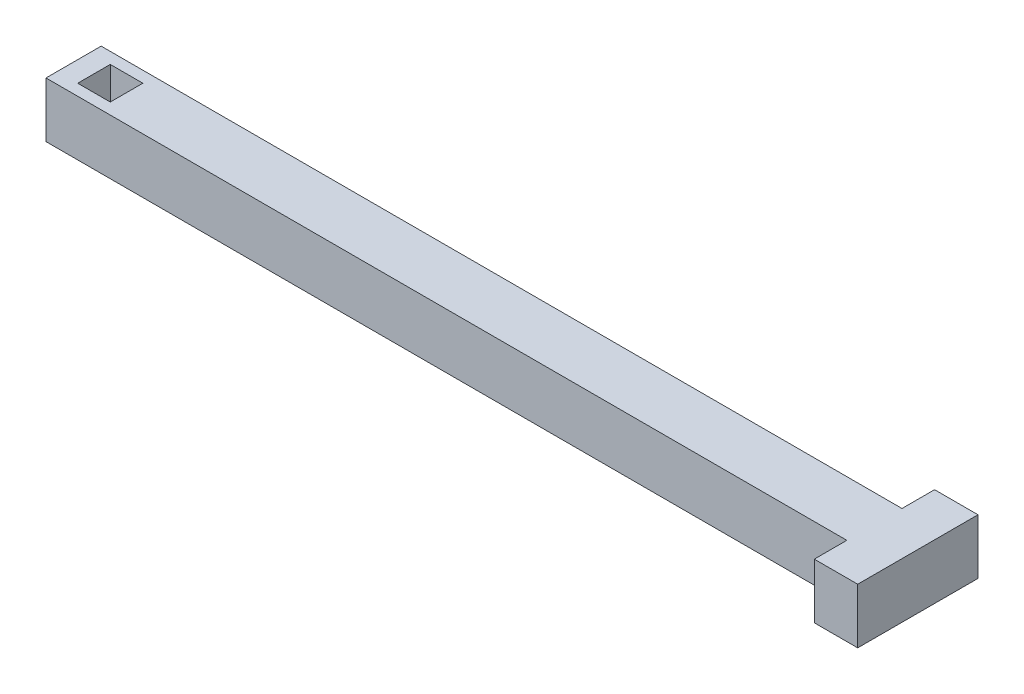
ISO-10303-21;
HEADER;
FILE_DESCRIPTION(('STEP AP214'),'2;1');
FILE_NAME('part.step','',(''),(''),'','','');
FILE_SCHEMA(('AUTOMOTIVE_DESIGN { 1 0 10303 214 1 1 1 1 }'));
ENDSEC;
DATA;
#1=APPLICATION_CONTEXT('core data for automotive mechanical design processes');
#2=APPLICATION_PROTOCOL_DEFINITION('international standard','automotive_design',2000,#1);
#3=PRODUCT_CONTEXT('',#1,'mechanical');
#4=PRODUCT('Part','Part','',(#3));
#5=PRODUCT_RELATED_PRODUCT_CATEGORY('part','',(#4));
#6=PRODUCT_DEFINITION_FORMATION('','',#4);
#7=PRODUCT_DEFINITION_CONTEXT('part definition',#1,'design');
#8=PRODUCT_DEFINITION('design','',#6,#7);
#9=PRODUCT_DEFINITION_SHAPE('','',#8);
#10=(LENGTH_UNIT() NAMED_UNIT(*) SI_UNIT(.MILLI.,.METRE.));
#11=(NAMED_UNIT(*) PLANE_ANGLE_UNIT() SI_UNIT($,.RADIAN.));
#12=(NAMED_UNIT(*) SI_UNIT($,.STERADIAN.) SOLID_ANGLE_UNIT());
#13=UNCERTAINTY_MEASURE_WITH_UNIT(LENGTH_MEASURE(1.E-05),#10,'distance_accuracy_value','');
#14=(GEOMETRIC_REPRESENTATION_CONTEXT(3) GLOBAL_UNCERTAINTY_ASSIGNED_CONTEXT((#13)) GLOBAL_UNIT_ASSIGNED_CONTEXT((#10,
#11,#12)) REPRESENTATION_CONTEXT('',''));
#15=CARTESIAN_POINT('',(0.,0.,0.));
#16=DIRECTION('',(0.,0.,1.));
#17=DIRECTION('',(1.,0.,0.));
#18=AXIS2_PLACEMENT_3D('',#15,#16,#17);
#19=CARTESIAN_POINT('',(0.,2.54,0.));
#20=DIRECTION('',(0.,1.,0.));
#21=DIRECTION('',(0.,0.,1.));
#22=AXIS2_PLACEMENT_3D('',#19,#20,#21);
#23=PLANE('',#22);
#24=DIRECTION('',(0.,0.,1.));
#25=VECTOR('',#24,1.);
#26=CARTESIAN_POINT('',(-18.44,2.54,1.27));
#27=LINE('',#26,#25);
#28=CARTESIAN_POINT('',(-18.44,2.54,-1.27));
#29=VERTEX_POINT('',#28);
#30=CARTESIAN_POINT('',(-18.44,2.54,1.27));
#31=VERTEX_POINT('',#30);
#32=EDGE_CURVE('E158',#29,#31,#27,.T.);
#33=ORIENTED_EDGE('',*,*,#32,.T.);
#34=DIRECTION('',(1.,0.,0.));
#35=VECTOR('',#34,1.);
#36=CARTESIAN_POINT('',(18.44,2.54,1.27));
#37=LINE('',#36,#35);
#38=CARTESIAN_POINT('',(18.44,2.54,1.27));
#39=VERTEX_POINT('',#38);
#40=EDGE_CURVE('E161',#31,#39,#37,.T.);
#41=ORIENTED_EDGE('',*,*,#40,.T.);
#42=DIRECTION('',(0.,0.,1.));
#43=VECTOR('',#42,1.);
#44=CARTESIAN_POINT('',(18.44,2.54,2.77000000000001));
#45=LINE('',#44,#43);
#46=CARTESIAN_POINT('',(18.44,2.54,2.77000000000001));
#47=VERTEX_POINT('',#46);
#48=EDGE_CURVE('E164',#39,#47,#45,.T.);
#49=ORIENTED_EDGE('',*,*,#48,.T.);
#50=DIRECTION('',(1.,0.,0.));
#51=VECTOR('',#50,1.);
#52=CARTESIAN_POINT('',(20.44,2.54,2.77000000000001));
#53=LINE('',#52,#51);
#54=CARTESIAN_POINT('',(20.44,2.54,2.77000000000001));
#55=VERTEX_POINT('',#54);
#56=EDGE_CURVE('E166',#47,#55,#53,.T.);
#57=ORIENTED_EDGE('',*,*,#56,.T.);
#58=DIRECTION('',(0.,0.,-1.));
#59=VECTOR('',#58,1.);
#60=CARTESIAN_POINT('',(20.44,2.54,-2.77000000000001));
#61=LINE('',#60,#59);
#62=CARTESIAN_POINT('',(20.44,2.54,-2.77000000000001));
#63=VERTEX_POINT('',#62);
#64=EDGE_CURVE('E168',#55,#63,#61,.T.);
#65=ORIENTED_EDGE('',*,*,#64,.T.);
#66=DIRECTION('',(-1.,0.,0.));
#67=VECTOR('',#66,1.);
#68=CARTESIAN_POINT('',(18.44,2.54,-2.77000000000001));
#69=LINE('',#68,#67);
#70=CARTESIAN_POINT('',(18.44,2.54,-2.77000000000001));
#71=VERTEX_POINT('',#70);
#72=EDGE_CURVE('E170',#63,#71,#69,.T.);
#73=ORIENTED_EDGE('',*,*,#72,.T.);
#74=DIRECTION('',(0.,0.,1.));
#75=VECTOR('',#74,1.);
#76=CARTESIAN_POINT('',(18.44,2.54,-1.27000000000001));
#77=LINE('',#76,#75);
#78=CARTESIAN_POINT('',(18.44,2.54,-1.27000000000001));
#79=VERTEX_POINT('',#78);
#80=EDGE_CURVE('E172',#71,#79,#77,.T.);
#81=ORIENTED_EDGE('',*,*,#80,.T.);
#82=DIRECTION('',(-1.,0.,0.));
#83=VECTOR('',#82,1.);
#84=CARTESIAN_POINT('',(18.44,2.54,-1.27000000000001));
#85=LINE('',#84,#83);
#86=EDGE_CURVE('E174',#79,#29,#85,.T.);
#87=ORIENTED_EDGE('',*,*,#86,.T.);
#88=EDGE_LOOP('',(#33,#41,#49,#57,#65,#73,#81,#87));
#89=FACE_BOUND('',#88,.T.);
#90=DIRECTION('',(1.,0.,0.));
#91=VECTOR('',#90,1.);
#92=CARTESIAN_POINT('',(-17.5,2.54,0.749999999999998));
#93=LINE('',#92,#91);
#94=CARTESIAN_POINT('',(-17.5,2.54,0.749999999999998));
#95=VERTEX_POINT('',#94);
#96=CARTESIAN_POINT('',(-16.,2.54,0.749999999999998));
#97=VERTEX_POINT('',#96);
#98=EDGE_CURVE('E130',#95,#97,#93,.T.);
#99=ORIENTED_EDGE('',*,*,#98,.F.);
#100=DIRECTION('',(0.,0.,1.));
#101=VECTOR('',#100,1.);
#102=CARTESIAN_POINT('',(-17.5,2.54,-0.749999999999998));
#103=LINE('',#102,#101);
#104=CARTESIAN_POINT('',(-17.5,2.54,-0.749999999999998));
#105=VERTEX_POINT('',#104);
#106=EDGE_CURVE('E122',#105,#95,#103,.T.);
#107=ORIENTED_EDGE('',*,*,#106,.F.);
#108=DIRECTION('',(-1.,0.,0.));
#109=VECTOR('',#108,1.);
#110=CARTESIAN_POINT('',(-17.5,2.54,-0.749999999999998));
#111=LINE('',#110,#109);
#112=CARTESIAN_POINT('',(-16.,2.54,-0.749999999999998));
#113=VERTEX_POINT('',#112);
#114=EDGE_CURVE('E144',#113,#105,#111,.T.);
#115=ORIENTED_EDGE('',*,*,#114,.F.);
#116=DIRECTION('',(0.,0.,-1.));
#117=VECTOR('',#116,1.);
#118=CARTESIAN_POINT('',(-16.,2.54,-0.749999999999998));
#119=LINE('',#118,#117);
#120=EDGE_CURVE('E142',#97,#113,#119,.T.);
#121=ORIENTED_EDGE('',*,*,#120,.F.);
#122=EDGE_LOOP('',(#99,#107,#115,#121));
#123=FACE_BOUND('',#122,.T.);
#124=ADVANCED_FACE('F33',(#89,#123),#23,.T.);
#125=CARTESIAN_POINT('',(0.,0.,0.));
#126=DIRECTION('',(0.,1.,0.));
#127=DIRECTION('',(0.,0.,1.));
#128=AXIS2_PLACEMENT_3D('',#125,#126,#127);
#129=PLANE('',#128);
#130=DIRECTION('',(0.,0.,1.));
#131=VECTOR('',#130,1.);
#132=CARTESIAN_POINT('',(-18.44,0.,1.27));
#133=LINE('',#132,#131);
#134=CARTESIAN_POINT('',(-18.44,0.,-1.27));
#135=VERTEX_POINT('',#134);
#136=CARTESIAN_POINT('',(-18.44,0.,1.27));
#137=VERTEX_POINT('',#136);
#138=EDGE_CURVE('E138',#135,#137,#133,.T.);
#139=ORIENTED_EDGE('',*,*,#138,.F.);
#140=DIRECTION('',(-1.,0.,0.));
#141=VECTOR('',#140,1.);
#142=CARTESIAN_POINT('',(18.44,0.,-1.27000000000001));
#143=LINE('',#142,#141);
#144=CARTESIAN_POINT('',(18.44,0.,-1.27000000000001));
#145=VERTEX_POINT('',#144);
#146=EDGE_CURVE('E162',#145,#135,#143,.T.);
#147=ORIENTED_EDGE('',*,*,#146,.F.);
#148=DIRECTION('',(0.,0.,1.));
#149=VECTOR('',#148,1.);
#150=CARTESIAN_POINT('',(18.44,0.,-1.27000000000001));
#151=LINE('',#150,#149);
#152=CARTESIAN_POINT('',(18.44,0.,-2.77000000000001));
#153=VERTEX_POINT('',#152);
#154=EDGE_CURVE('E189',#153,#145,#151,.T.);
#155=ORIENTED_EDGE('',*,*,#154,.F.);
#156=DIRECTION('',(-1.,0.,0.));
#157=VECTOR('',#156,1.);
#158=CARTESIAN_POINT('',(18.44,0.,-2.77000000000001));
#159=LINE('',#158,#157);
#160=CARTESIAN_POINT('',(20.44,0.,-2.77000000000001));
#161=VERTEX_POINT('',#160);
#162=EDGE_CURVE('E187',#161,#153,#159,.T.);
#163=ORIENTED_EDGE('',*,*,#162,.F.);
#164=DIRECTION('',(0.,0.,-1.));
#165=VECTOR('',#164,1.);
#166=CARTESIAN_POINT('',(20.44,0.,-2.77000000000001));
#167=LINE('',#166,#165);
#168=CARTESIAN_POINT('',(20.44,0.,2.77000000000001));
#169=VERTEX_POINT('',#168);
#170=EDGE_CURVE('E185',#169,#161,#167,.T.);
#171=ORIENTED_EDGE('',*,*,#170,.F.);
#172=DIRECTION('',(1.,0.,0.));
#173=VECTOR('',#172,1.);
#174=CARTESIAN_POINT('',(20.44,0.,2.77000000000001));
#175=LINE('',#174,#173);
#176=CARTESIAN_POINT('',(18.44,0.,2.77000000000001));
#177=VERTEX_POINT('',#176);
#178=EDGE_CURVE('E183',#177,#169,#175,.T.);
#179=ORIENTED_EDGE('',*,*,#178,.F.);
#180=DIRECTION('',(0.,0.,1.));
#181=VECTOR('',#180,1.);
#182=CARTESIAN_POINT('',(18.44,0.,2.77000000000001));
#183=LINE('',#182,#181);
#184=CARTESIAN_POINT('',(18.44,0.,1.27));
#185=VERTEX_POINT('',#184);
#186=EDGE_CURVE('E181',#185,#177,#183,.T.);
#187=ORIENTED_EDGE('',*,*,#186,.F.);
#188=DIRECTION('',(1.,0.,0.));
#189=VECTOR('',#188,1.);
#190=CARTESIAN_POINT('',(18.44,0.,1.27));
#191=LINE('',#190,#189);
#192=EDGE_CURVE('E179',#137,#185,#191,.T.);
#193=ORIENTED_EDGE('',*,*,#192,.F.);
#194=EDGE_LOOP('',(#139,#147,#155,#163,#171,#179,#187,#193));
#195=FACE_BOUND('',#194,.T.);
#196=DIRECTION('',(0.,0.,1.));
#197=VECTOR('',#196,1.);
#198=CARTESIAN_POINT('',(-17.5,0.,-0.749999999999998));
#199=LINE('',#198,#197);
#200=CARTESIAN_POINT('',(-17.5,0.,-0.749999999999998));
#201=VERTEX_POINT('',#200);
#202=CARTESIAN_POINT('',(-17.5,0.,0.749999999999998));
#203=VERTEX_POINT('',#202);
#204=EDGE_CURVE('E56',#201,#203,#199,.T.);
#205=ORIENTED_EDGE('',*,*,#204,.T.);
#206=DIRECTION('',(1.,0.,0.));
#207=VECTOR('',#206,1.);
#208=CARTESIAN_POINT('',(-17.5,0.,0.749999999999998));
#209=LINE('',#208,#207);
#210=CARTESIAN_POINT('',(-16.,0.,0.749999999999998));
#211=VERTEX_POINT('',#210);
#212=EDGE_CURVE('E137',#203,#211,#209,.T.);
#213=ORIENTED_EDGE('',*,*,#212,.T.);
#214=DIRECTION('',(0.,0.,-1.));
#215=VECTOR('',#214,1.);
#216=CARTESIAN_POINT('',(-16.,0.,-0.749999999999998));
#217=LINE('',#216,#215);
#218=CARTESIAN_POINT('',(-16.,0.,-0.749999999999998));
#219=VERTEX_POINT('',#218);
#220=EDGE_CURVE('E150',#211,#219,#217,.T.);
#221=ORIENTED_EDGE('',*,*,#220,.T.);
#222=DIRECTION('',(-1.,0.,0.));
#223=VECTOR('',#222,1.);
#224=CARTESIAN_POINT('',(-17.5,0.,-0.749999999999998));
#225=LINE('',#224,#223);
#226=EDGE_CURVE('E131',#219,#201,#225,.T.);
#227=ORIENTED_EDGE('',*,*,#226,.T.);
#228=EDGE_LOOP('',(#205,#213,#221,#227));
#229=FACE_BOUND('',#228,.T.);
#230=ADVANCED_FACE('F219',(#195,#229),#129,.F.);
#231=CARTESIAN_POINT('',(-18.44,2.54,1.27));
#232=DIRECTION('',(1.,0.,0.));
#233=DIRECTION('',(0.,0.,-1.));
#234=AXIS2_PLACEMENT_3D('',#231,#232,#233);
#235=PLANE('',#234);
#236=ORIENTED_EDGE('',*,*,#138,.T.);
#237=DIRECTION('',(0.,-1.,0.));
#238=VECTOR('',#237,1.);
#239=CARTESIAN_POINT('',(-18.44,2.54,1.27));
#240=LINE('',#239,#238);
#241=EDGE_CURVE('E11',#31,#137,#240,.T.);
#242=ORIENTED_EDGE('',*,*,#241,.F.);
#243=ORIENTED_EDGE('',*,*,#32,.F.);
#244=DIRECTION('',(0.,-1.,0.));
#245=VECTOR('',#244,1.);
#246=CARTESIAN_POINT('',(-18.44,2.54,-1.27));
#247=LINE('',#246,#245);
#248=EDGE_CURVE('E176',#29,#135,#247,.T.);
#249=ORIENTED_EDGE('',*,*,#248,.T.);
#250=EDGE_LOOP('',(#236,#242,#243,#249));
#251=FACE_BOUND('',#250,.T.);
#252=ADVANCED_FACE('F35',(#251),#235,.F.);
#253=CARTESIAN_POINT('',(18.44,2.54,1.27));
#254=DIRECTION('',(0.,0.,-1.));
#255=DIRECTION('',(-1.,0.,0.));
#256=AXIS2_PLACEMENT_3D('',#253,#254,#255);
#257=PLANE('',#256);
#258=ORIENTED_EDGE('',*,*,#192,.T.);
#259=DIRECTION('',(0.,-1.,0.));
#260=VECTOR('',#259,1.);
#261=CARTESIAN_POINT('',(18.44,2.54,1.27));
#262=LINE('',#261,#260);
#263=EDGE_CURVE('E41',#39,#185,#262,.T.);
#264=ORIENTED_EDGE('',*,*,#263,.F.);
#265=ORIENTED_EDGE('',*,*,#40,.F.);
#266=ORIENTED_EDGE('',*,*,#241,.T.);
#267=EDGE_LOOP('',(#258,#264,#265,#266));
#268=FACE_BOUND('',#267,.T.);
#269=ADVANCED_FACE('F236',(#268),#257,.F.);
#270=CARTESIAN_POINT('',(18.44,2.54,2.77000000000001));
#271=DIRECTION('',(1.,0.,0.));
#272=DIRECTION('',(0.,0.,-1.));
#273=AXIS2_PLACEMENT_3D('',#270,#271,#272);
#274=PLANE('',#273);
#275=ORIENTED_EDGE('',*,*,#186,.T.);
#276=DIRECTION('',(0.,-1.,0.));
#277=VECTOR('',#276,1.);
#278=CARTESIAN_POINT('',(18.44,2.54,2.77000000000001));
#279=LINE('',#278,#277);
#280=EDGE_CURVE('E206',#47,#177,#279,.T.);
#281=ORIENTED_EDGE('',*,*,#280,.F.);
#282=ORIENTED_EDGE('',*,*,#48,.F.);
#283=ORIENTED_EDGE('',*,*,#263,.T.);
#284=EDGE_LOOP('',(#275,#281,#282,#283));
#285=FACE_BOUND('',#284,.T.);
#286=ADVANCED_FACE('F213',(#285),#274,.F.);
#287=CARTESIAN_POINT('',(20.44,2.54,2.77000000000001));
#288=DIRECTION('',(0.,0.,-1.));
#289=DIRECTION('',(-1.,0.,0.));
#290=AXIS2_PLACEMENT_3D('',#287,#288,#289);
#291=PLANE('',#290);
#292=ORIENTED_EDGE('',*,*,#178,.T.);
#293=DIRECTION('',(0.,-1.,0.));
#294=VECTOR('',#293,1.);
#295=CARTESIAN_POINT('',(20.44,2.54,2.77000000000001));
#296=LINE('',#295,#294);
#297=EDGE_CURVE('E203',#55,#169,#296,.T.);
#298=ORIENTED_EDGE('',*,*,#297,.F.);
#299=ORIENTED_EDGE('',*,*,#56,.F.);
#300=ORIENTED_EDGE('',*,*,#280,.T.);
#301=EDGE_LOOP('',(#292,#298,#299,#300));
#302=FACE_BOUND('',#301,.T.);
#303=ADVANCED_FACE('F225',(#302),#291,.F.);
#304=CARTESIAN_POINT('',(20.44,2.54,-2.77000000000001));
#305=DIRECTION('',(-1.,0.,0.));
#306=DIRECTION('',(0.,0.,1.));
#307=AXIS2_PLACEMENT_3D('',#304,#305,#306);
#308=PLANE('',#307);
#309=ORIENTED_EDGE('',*,*,#170,.T.);
#310=DIRECTION('',(0.,-1.,0.));
#311=VECTOR('',#310,1.);
#312=CARTESIAN_POINT('',(20.44,2.54,-2.77000000000001));
#313=LINE('',#312,#311);
#314=EDGE_CURVE('E200',#63,#161,#313,.T.);
#315=ORIENTED_EDGE('',*,*,#314,.F.);
#316=ORIENTED_EDGE('',*,*,#64,.F.);
#317=ORIENTED_EDGE('',*,*,#297,.T.);
#318=EDGE_LOOP('',(#309,#315,#316,#317));
#319=FACE_BOUND('',#318,.T.);
#320=ADVANCED_FACE('F229',(#319),#308,.F.);
#321=CARTESIAN_POINT('',(18.44,2.54,-2.77000000000001));
#322=DIRECTION('',(0.,0.,1.));
#323=DIRECTION('',(1.,0.,0.));
#324=AXIS2_PLACEMENT_3D('',#321,#322,#323);
#325=PLANE('',#324);
#326=ORIENTED_EDGE('',*,*,#162,.T.);
#327=DIRECTION('',(0.,-1.,0.));
#328=VECTOR('',#327,1.);
#329=CARTESIAN_POINT('',(18.44,2.54,-2.77000000000001));
#330=LINE('',#329,#328);
#331=EDGE_CURVE('E197',#71,#153,#330,.T.);
#332=ORIENTED_EDGE('',*,*,#331,.F.);
#333=ORIENTED_EDGE('',*,*,#72,.F.);
#334=ORIENTED_EDGE('',*,*,#314,.T.);
#335=EDGE_LOOP('',(#326,#332,#333,#334));
#336=FACE_BOUND('',#335,.T.);
#337=ADVANCED_FACE('F249',(#336),#325,.F.);
#338=CARTESIAN_POINT('',(18.44,2.54,-1.27000000000001));
#339=DIRECTION('',(1.,0.,0.));
#340=DIRECTION('',(0.,0.,-1.));
#341=AXIS2_PLACEMENT_3D('',#338,#339,#340);
#342=PLANE('',#341);
#343=ORIENTED_EDGE('',*,*,#154,.T.);
#344=DIRECTION('',(0.,-1.,0.));
#345=VECTOR('',#344,1.);
#346=CARTESIAN_POINT('',(18.44,2.54,-1.27000000000001));
#347=LINE('',#346,#345);
#348=EDGE_CURVE('E194',#79,#145,#347,.T.);
#349=ORIENTED_EDGE('',*,*,#348,.F.);
#350=ORIENTED_EDGE('',*,*,#80,.F.);
#351=ORIENTED_EDGE('',*,*,#331,.T.);
#352=EDGE_LOOP('',(#343,#349,#350,#351));
#353=FACE_BOUND('',#352,.T.);
#354=ADVANCED_FACE('F247',(#353),#342,.F.);
#355=CARTESIAN_POINT('',(18.44,2.54,-1.27000000000001));
#356=DIRECTION('',(0.,0.,1.));
#357=DIRECTION('',(1.,0.,0.));
#358=AXIS2_PLACEMENT_3D('',#355,#356,#357);
#359=PLANE('',#358);
#360=ORIENTED_EDGE('',*,*,#146,.T.);
#361=ORIENTED_EDGE('',*,*,#248,.F.);
#362=ORIENTED_EDGE('',*,*,#86,.F.);
#363=ORIENTED_EDGE('',*,*,#348,.T.);
#364=EDGE_LOOP('',(#360,#361,#362,#363));
#365=FACE_BOUND('',#364,.T.);
#366=ADVANCED_FACE('F242',(#365),#359,.F.);
#367=CARTESIAN_POINT('',(-17.5,2.54,-0.749999999999998));
#368=DIRECTION('',(1.,0.,0.));
#369=DIRECTION('',(0.,0.,-1.));
#370=AXIS2_PLACEMENT_3D('',#367,#368,#369);
#371=PLANE('',#370);
#372=ORIENTED_EDGE('',*,*,#204,.F.);
#373=DIRECTION('',(0.,-1.,0.));
#374=VECTOR('',#373,1.);
#375=CARTESIAN_POINT('',(-17.5,2.54,-0.749999999999998));
#376=LINE('',#375,#374);
#377=EDGE_CURVE('E126',#105,#201,#376,.T.);
#378=ORIENTED_EDGE('',*,*,#377,.F.);
#379=ORIENTED_EDGE('',*,*,#106,.T.);
#380=DIRECTION('',(0.,-1.,0.));
#381=VECTOR('',#380,1.);
#382=CARTESIAN_POINT('',(-17.5,2.54,0.749999999999998));
#383=LINE('',#382,#381);
#384=EDGE_CURVE('E125',#95,#203,#383,.T.);
#385=ORIENTED_EDGE('',*,*,#384,.T.);
#386=EDGE_LOOP('',(#372,#378,#379,#385));
#387=FACE_BOUND('',#386,.T.);
#388=ADVANCED_FACE('F124',(#387),#371,.T.);
#389=CARTESIAN_POINT('',(-17.5,2.54,0.749999999999998));
#390=DIRECTION('',(0.,0.,-1.));
#391=DIRECTION('',(-1.,0.,0.));
#392=AXIS2_PLACEMENT_3D('',#389,#390,#391);
#393=PLANE('',#392);
#394=ORIENTED_EDGE('',*,*,#212,.F.);
#395=ORIENTED_EDGE('',*,*,#384,.F.);
#396=ORIENTED_EDGE('',*,*,#98,.T.);
#397=DIRECTION('',(0.,-1.,0.));
#398=VECTOR('',#397,1.);
#399=CARTESIAN_POINT('',(-16.,2.54,0.749999999999998));
#400=LINE('',#399,#398);
#401=EDGE_CURVE('E139',#97,#211,#400,.T.);
#402=ORIENTED_EDGE('',*,*,#401,.T.);
#403=EDGE_LOOP('',(#394,#395,#396,#402));
#404=FACE_BOUND('',#403,.T.);
#405=ADVANCED_FACE('F134',(#404),#393,.T.);
#406=CARTESIAN_POINT('',(-16.,2.54,-0.749999999999998));
#407=DIRECTION('',(-1.,0.,0.));
#408=DIRECTION('',(0.,0.,1.));
#409=AXIS2_PLACEMENT_3D('',#406,#407,#408);
#410=PLANE('',#409);
#411=ORIENTED_EDGE('',*,*,#220,.F.);
#412=ORIENTED_EDGE('',*,*,#401,.F.);
#413=ORIENTED_EDGE('',*,*,#120,.T.);
#414=DIRECTION('',(0.,-1.,0.));
#415=VECTOR('',#414,1.);
#416=CARTESIAN_POINT('',(-16.,2.54,-0.749999999999998));
#417=LINE('',#416,#415);
#418=EDGE_CURVE('E48',#113,#219,#417,.T.);
#419=ORIENTED_EDGE('',*,*,#418,.T.);
#420=EDGE_LOOP('',(#411,#412,#413,#419));
#421=FACE_BOUND('',#420,.T.);
#422=ADVANCED_FACE('F274',(#421),#410,.T.);
#423=CARTESIAN_POINT('',(-17.5,2.54,-0.749999999999998));
#424=DIRECTION('',(0.,0.,1.));
#425=DIRECTION('',(1.,0.,0.));
#426=AXIS2_PLACEMENT_3D('',#423,#424,#425);
#427=PLANE('',#426);
#428=ORIENTED_EDGE('',*,*,#226,.F.);
#429=ORIENTED_EDGE('',*,*,#418,.F.);
#430=ORIENTED_EDGE('',*,*,#114,.T.);
#431=ORIENTED_EDGE('',*,*,#377,.T.);
#432=EDGE_LOOP('',(#428,#429,#430,#431));
#433=FACE_BOUND('',#432,.T.);
#434=ADVANCED_FACE('F278',(#433),#427,.T.);
#435=CLOSED_SHELL('',(#124,#230,#252,#269,#286,#303,#320,#337,#354,#366,#388,#405,#422,#434));
#436=MANIFOLD_SOLID_BREP('B2',#435);
#437=ADVANCED_BREP_SHAPE_REPRESENTATION('',(#18,#436),#14);
#438=SHAPE_DEFINITION_REPRESENTATION(#9,#437);
ENDSEC;
END-ISO-10303-21;
